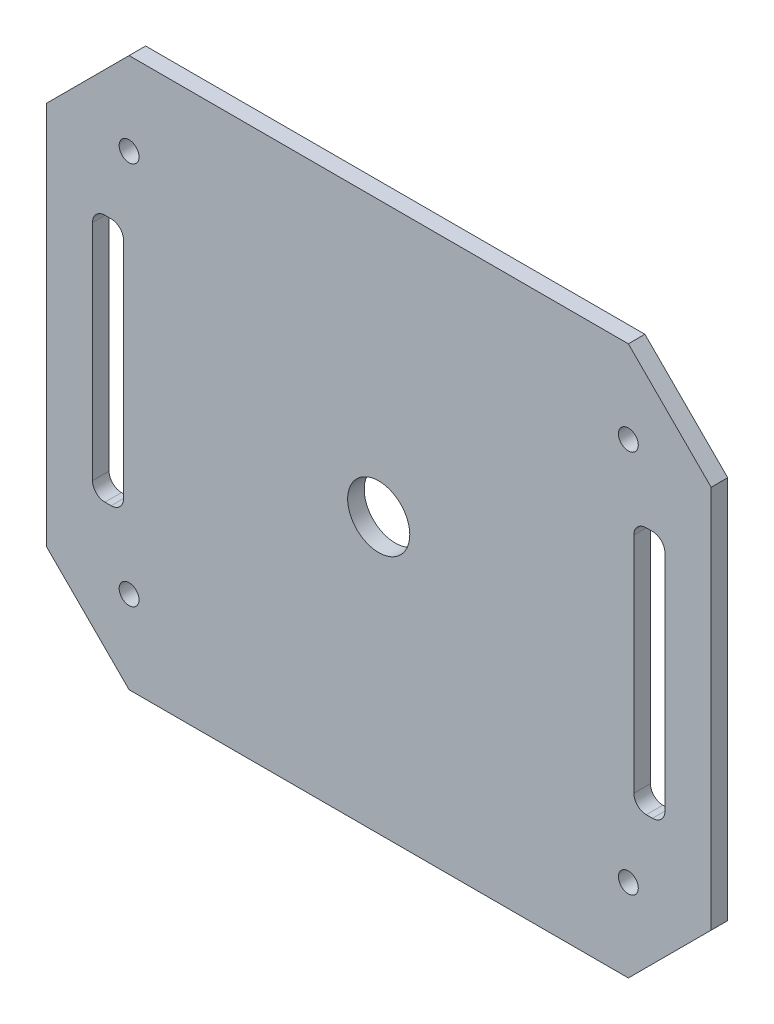
ISO-10303-21;
HEADER;
FILE_DESCRIPTION(('STEP AP214'),'2;1');
FILE_NAME('part.step','',(''),(''),'','','');
FILE_SCHEMA(('AUTOMOTIVE_DESIGN { 1 0 10303 214 1 1 1 1 }'));
ENDSEC;
DATA;
#1=APPLICATION_CONTEXT('core data for automotive mechanical design processes');
#2=APPLICATION_PROTOCOL_DEFINITION('international standard','automotive_design',2000,#1);
#3=PRODUCT_CONTEXT('',#1,'mechanical');
#4=PRODUCT('Part','Part','',(#3));
#5=PRODUCT_RELATED_PRODUCT_CATEGORY('part','',(#4));
#6=PRODUCT_DEFINITION_FORMATION('','',#4);
#7=PRODUCT_DEFINITION_CONTEXT('part definition',#1,'design');
#8=PRODUCT_DEFINITION('design','',#6,#7);
#9=PRODUCT_DEFINITION_SHAPE('','',#8);
#10=(LENGTH_UNIT() NAMED_UNIT(*) SI_UNIT(.MILLI.,.METRE.));
#11=(NAMED_UNIT(*) PLANE_ANGLE_UNIT() SI_UNIT($,.RADIAN.));
#12=(NAMED_UNIT(*) SI_UNIT($,.STERADIAN.) SOLID_ANGLE_UNIT());
#13=UNCERTAINTY_MEASURE_WITH_UNIT(LENGTH_MEASURE(1.E-05),#10,'distance_accuracy_value','');
#14=(GEOMETRIC_REPRESENTATION_CONTEXT(3) GLOBAL_UNCERTAINTY_ASSIGNED_CONTEXT((#13)) GLOBAL_UNIT_ASSIGNED_CONTEXT((#10,
#11,#12)) REPRESENTATION_CONTEXT('',''));
#15=CARTESIAN_POINT('',(0.,0.,0.));
#16=DIRECTION('',(0.,0.,1.));
#17=DIRECTION('',(1.,0.,0.));
#18=AXIS2_PLACEMENT_3D('',#15,#16,#17);
#19=CARTESIAN_POINT('',(0.,0.,3.));
#20=DIRECTION('',(0.,0.,1.));
#21=DIRECTION('',(1.,0.,0.));
#22=AXIS2_PLACEMENT_3D('',#19,#20,#21);
#23=PLANE('',#22);
#24=CARTESIAN_POINT('',(0.164261760075,-107.544565590663,3.));
#25=DIRECTION('',(0.,0.,1.));
#26=DIRECTION('',(1.,0.,0.));
#27=AXIS2_PLACEMENT_3D('',#24,#25,#26);
#28=CIRCLE('',#27,1.8);
#29=CARTESIAN_POINT('',(1.964261760075,-107.544565590663,3.));
#30=VERTEX_POINT('',#29);
#31=EDGE_CURVE('E662',#30,#30,#28,.T.);
#32=ORIENTED_EDGE('',*,*,#31,.F.);
#33=EDGE_LOOP('',(#32));
#34=FACE_BOUND('',#33,.T.);
#35=CARTESIAN_POINT('',(90.588261760075,-38.0755655906625,3.));
#36=DIRECTION('',(0.,0.,1.));
#37=DIRECTION('',(1.,0.,0.));
#38=AXIS2_PLACEMENT_3D('',#35,#36,#37);
#39=CIRCLE('',#38,1.80000000000001);
#40=CARTESIAN_POINT('',(92.388261760075,-38.0755655906625,3.));
#41=VERTEX_POINT('',#40);
#42=EDGE_CURVE('E674',#41,#41,#39,.T.);
#43=ORIENTED_EDGE('',*,*,#42,.F.);
#44=EDGE_LOOP('',(#43));
#45=FACE_BOUND('',#44,.T.);
#46=DIRECTION('',(0.,1.,0.));
#47=VECTOR('',#46,1.);
#48=CARTESIAN_POINT('',(-0.835738239925015,-52.5600655906625,3.));
#49=LINE('',#48,#47);
#50=CARTESIAN_POINT('',(-0.835738239925015,-93.0600655906625,3.));
#51=VERTEX_POINT('',#50);
#52=CARTESIAN_POINT('',(-0.835738239925015,-52.5600655906625,3.));
#53=VERTEX_POINT('',#52);
#54=EDGE_CURVE('E202',#51,#53,#49,.T.);
#55=ORIENTED_EDGE('',*,*,#54,.F.);
#56=CARTESIAN_POINT('',(-3.08573823992502,-93.0600655906625,3.));
#57=DIRECTION('',(0.,0.,1.));
#58=DIRECTION('',(1.,0.,0.));
#59=AXIS2_PLACEMENT_3D('',#56,#57,#58);
#60=CIRCLE('',#59,2.25);
#61=CARTESIAN_POINT('',(-3.08573823992503,-95.3100655906625,3.));
#62=VERTEX_POINT('',#61);
#63=EDGE_CURVE('E194',#62,#51,#60,.T.);
#64=ORIENTED_EDGE('',*,*,#63,.F.);
#65=DIRECTION('',(1.,0.,0.));
#66=VECTOR('',#65,1.);
#67=CARTESIAN_POINT('',(-4.21073823992503,-95.3100655906625,3.));
#68=LINE('',#67,#66);
#69=CARTESIAN_POINT('',(-4.21073823992503,-95.3100655906625,3.));
#70=VERTEX_POINT('',#69);
#71=EDGE_CURVE('E229',#70,#62,#68,.T.);
#72=ORIENTED_EDGE('',*,*,#71,.F.);
#73=CARTESIAN_POINT('',(-4.21073823992503,-93.0600655906625,3.));
#74=DIRECTION('',(0.,0.,1.));
#75=DIRECTION('',(1.,0.,0.));
#76=AXIS2_PLACEMENT_3D('',#73,#74,#75);
#77=CIRCLE('',#76,2.25);
#78=CARTESIAN_POINT('',(-6.46073823992504,-93.0600655906625,3.));
#79=VERTEX_POINT('',#78);
#80=EDGE_CURVE('E227',#79,#70,#77,.T.);
#81=ORIENTED_EDGE('',*,*,#80,.F.);
#82=DIRECTION('',(0.,-1.,0.));
#83=VECTOR('',#82,1.);
#84=CARTESIAN_POINT('',(-6.46073823992504,-52.5600655906625,3.));
#85=LINE('',#84,#83);
#86=CARTESIAN_POINT('',(-6.46073823992504,-52.5600655906625,3.));
#87=VERTEX_POINT('',#86);
#88=EDGE_CURVE('E225',#87,#79,#85,.T.);
#89=ORIENTED_EDGE('',*,*,#88,.F.);
#90=CARTESIAN_POINT('',(-4.21073823992503,-52.5600655906625,3.));
#91=DIRECTION('',(0.,0.,1.));
#92=DIRECTION('',(1.,0.,0.));
#93=AXIS2_PLACEMENT_3D('',#90,#91,#92);
#94=CIRCLE('',#93,2.25);
#95=CARTESIAN_POINT('',(-4.21073823992503,-50.3100655906625,3.));
#96=VERTEX_POINT('',#95);
#97=EDGE_CURVE('E223',#96,#87,#94,.T.);
#98=ORIENTED_EDGE('',*,*,#97,.F.);
#99=DIRECTION('',(-1.,0.,0.));
#100=VECTOR('',#99,1.);
#101=CARTESIAN_POINT('',(-4.21073823992503,-50.3100655906625,3.));
#102=LINE('',#101,#100);
#103=CARTESIAN_POINT('',(-3.08573823992503,-50.3100655906625,3.));
#104=VERTEX_POINT('',#103);
#105=EDGE_CURVE('E218',#104,#96,#102,.T.);
#106=ORIENTED_EDGE('',*,*,#105,.F.);
#107=CARTESIAN_POINT('',(-3.08573823992502,-52.5600655906625,3.));
#108=DIRECTION('',(0.,0.,1.));
#109=DIRECTION('',(1.,0.,0.));
#110=AXIS2_PLACEMENT_3D('',#107,#108,#109);
#111=CIRCLE('',#110,2.25);
#112=EDGE_CURVE('E216',#53,#104,#111,.T.);
#113=ORIENTED_EDGE('',*,*,#112,.F.);
#114=EDGE_LOOP('',(#55,#64,#72,#81,#89,#98,#106,#113));
#115=FACE_BOUND('',#114,.T.);
#116=DIRECTION('',(-1.,0.,0.));
#117=VECTOR('',#116,1.);
#118=CARTESIAN_POINT('',(94.963261760075,-50.3100655906625,3.));
#119=LINE('',#118,#117);
#120=CARTESIAN_POINT('',(94.963261760075,-50.3100655906625,3.));
#121=VERTEX_POINT('',#120);
#122=CARTESIAN_POINT('',(93.838261760075,-50.3100655906625,3.));
#123=VERTEX_POINT('',#122);
#124=EDGE_CURVE('E264',#121,#123,#119,.T.);
#125=ORIENTED_EDGE('',*,*,#124,.F.);
#126=CARTESIAN_POINT('',(94.963261760075,-52.5600655906625,3.));
#127=DIRECTION('',(0.,0.,1.));
#128=DIRECTION('',(1.,0.,0.));
#129=AXIS2_PLACEMENT_3D('',#126,#127,#128);
#130=CIRCLE('',#129,2.25000000000001);
#131=CARTESIAN_POINT('',(97.213261760075,-52.5600655906625,3.));
#132=VERTEX_POINT('',#131);
#133=EDGE_CURVE('E262',#132,#121,#130,.T.);
#134=ORIENTED_EDGE('',*,*,#133,.F.);
#135=DIRECTION('',(0.,1.,0.));
#136=VECTOR('',#135,1.);
#137=CARTESIAN_POINT('',(97.213261760075,-52.5600655906625,3.));
#138=LINE('',#137,#136);
#139=CARTESIAN_POINT('',(97.213261760075,-93.0600655906625,3.));
#140=VERTEX_POINT('',#139);
#141=EDGE_CURVE('E278',#140,#132,#138,.T.);
#142=ORIENTED_EDGE('',*,*,#141,.F.);
#143=CARTESIAN_POINT('',(94.963261760075,-93.0600655906625,3.));
#144=DIRECTION('',(0.,0.,1.));
#145=DIRECTION('',(1.,0.,0.));
#146=AXIS2_PLACEMENT_3D('',#143,#144,#145);
#147=CIRCLE('',#146,2.25);
#148=CARTESIAN_POINT('',(94.963261760075,-95.3100655906625,3.));
#149=VERTEX_POINT('',#148);
#150=EDGE_CURVE('E275',#149,#140,#147,.T.);
#151=ORIENTED_EDGE('',*,*,#150,.F.);
#152=DIRECTION('',(1.,0.,0.));
#153=VECTOR('',#152,1.);
#154=CARTESIAN_POINT('',(94.963261760075,-95.3100655906625,3.));
#155=LINE('',#154,#153);
#156=CARTESIAN_POINT('',(93.838261760075,-95.3100655906625,3.));
#157=VERTEX_POINT('',#156);
#158=EDGE_CURVE('E273',#157,#149,#155,.T.);
#159=ORIENTED_EDGE('',*,*,#158,.F.);
#160=CARTESIAN_POINT('',(93.838261760075,-93.0600655906625,3.));
#161=DIRECTION('',(0.,0.,1.));
#162=DIRECTION('',(1.,0.,0.));
#163=AXIS2_PLACEMENT_3D('',#160,#161,#162);
#164=CIRCLE('',#163,2.25);
#165=CARTESIAN_POINT('',(91.588261760075,-93.0600655906625,3.));
#166=VERTEX_POINT('',#165);
#167=EDGE_CURVE('E271',#166,#157,#164,.T.);
#168=ORIENTED_EDGE('',*,*,#167,.F.);
#169=DIRECTION('',(0.,-1.,0.));
#170=VECTOR('',#169,1.);
#171=CARTESIAN_POINT('',(91.588261760075,-52.5600655906625,3.));
#172=LINE('',#171,#170);
#173=CARTESIAN_POINT('',(91.588261760075,-52.5600655906625,3.));
#174=VERTEX_POINT('',#173);
#175=EDGE_CURVE('E269',#174,#166,#172,.T.);
#176=ORIENTED_EDGE('',*,*,#175,.F.);
#177=CARTESIAN_POINT('',(93.838261760075,-52.5600655906625,3.));
#178=DIRECTION('',(0.,0.,1.));
#179=DIRECTION('',(1.,0.,0.));
#180=AXIS2_PLACEMENT_3D('',#177,#178,#179);
#181=CIRCLE('',#180,2.25);
#182=EDGE_CURVE('E267',#123,#174,#181,.T.);
#183=ORIENTED_EDGE('',*,*,#182,.F.);
#184=EDGE_LOOP('',(#125,#134,#142,#151,#159,#168,#176,#183));
#185=FACE_BOUND('',#184,.T.);
#186=DIRECTION('',(0.,-1.,0.));
#187=VECTOR('',#186,1.);
#188=CARTESIAN_POINT('',(-14.835738239925,-38.0755655906625,3.));
#189=LINE('',#188,#187);
#190=CARTESIAN_POINT('',(-14.835738239925,-38.0755655906625,3.));
#191=VERTEX_POINT('',#190);
#192=CARTESIAN_POINT('',(-14.835738239925,-107.544565590663,3.));
#193=VERTEX_POINT('',#192);
#194=EDGE_CURVE('E321',#191,#193,#189,.T.);
#195=ORIENTED_EDGE('',*,*,#194,.T.);
#196=DIRECTION('',(0.707106781186547,-0.707106781186547,0.));
#197=VECTOR('',#196,1.);
#198=CARTESIAN_POINT('',(-14.835738239925,-107.544565590663,3.));
#199=LINE('',#198,#197);
#200=CARTESIAN_POINT('',(0.164261760075,-122.544565590663,3.));
#201=VERTEX_POINT('',#200);
#202=EDGE_CURVE('E324',#193,#201,#199,.T.);
#203=ORIENTED_EDGE('',*,*,#202,.T.);
#204=DIRECTION('',(1.,0.,0.));
#205=VECTOR('',#204,1.);
#206=CARTESIAN_POINT('',(0.164261760075,-122.544565590663,3.));
#207=LINE('',#206,#205);
#208=CARTESIAN_POINT('',(90.588261760075,-122.544565590663,3.));
#209=VERTEX_POINT('',#208);
#210=EDGE_CURVE('E327',#201,#209,#207,.T.);
#211=ORIENTED_EDGE('',*,*,#210,.T.);
#212=DIRECTION('',(0.707106781186547,0.707106781186547,0.));
#213=VECTOR('',#212,1.);
#214=CARTESIAN_POINT('',(90.588261760075,-122.544565590663,3.));
#215=LINE('',#214,#213);
#216=CARTESIAN_POINT('',(105.588261760075,-107.544565590663,3.));
#217=VERTEX_POINT('',#216);
#218=EDGE_CURVE('E329',#209,#217,#215,.T.);
#219=ORIENTED_EDGE('',*,*,#218,.T.);
#220=DIRECTION('',(0.,1.,0.));
#221=VECTOR('',#220,1.);
#222=CARTESIAN_POINT('',(105.588261760075,-38.0755655906625,3.));
#223=LINE('',#222,#221);
#224=CARTESIAN_POINT('',(105.588261760075,-38.0755655906625,3.));
#225=VERTEX_POINT('',#224);
#226=EDGE_CURVE('E331',#217,#225,#223,.T.);
#227=ORIENTED_EDGE('',*,*,#226,.T.);
#228=DIRECTION('',(-0.707106781186547,0.707106781186547,0.));
#229=VECTOR('',#228,1.);
#230=CARTESIAN_POINT('',(90.588261760075,-23.0755655906625,3.));
#231=LINE('',#230,#229);
#232=CARTESIAN_POINT('',(90.588261760075,-23.0755655906625,3.));
#233=VERTEX_POINT('',#232);
#234=EDGE_CURVE('E333',#225,#233,#231,.T.);
#235=ORIENTED_EDGE('',*,*,#234,.T.);
#236=DIRECTION('',(-1.,0.,0.));
#237=VECTOR('',#236,1.);
#238=CARTESIAN_POINT('',(0.164261760075,-23.0755655906625,3.));
#239=LINE('',#238,#237);
#240=CARTESIAN_POINT('',(0.164261760075,-23.0755655906625,3.));
#241=VERTEX_POINT('',#240);
#242=EDGE_CURVE('E335',#233,#241,#239,.T.);
#243=ORIENTED_EDGE('',*,*,#242,.T.);
#244=DIRECTION('',(-0.707106781186547,-0.707106781186547,0.));
#245=VECTOR('',#244,1.);
#246=CARTESIAN_POINT('',(-14.835738239925,-38.0755655906625,3.));
#247=LINE('',#246,#245);
#248=EDGE_CURVE('E337',#241,#191,#247,.T.);
#249=ORIENTED_EDGE('',*,*,#248,.T.);
#250=EDGE_LOOP('',(#195,#203,#211,#219,#227,#235,#243,#249));
#251=FACE_BOUND('',#250,.T.);
#252=CARTESIAN_POINT('',(0.164261760075,-38.0755655906625,3.));
#253=DIRECTION('',(0.,0.,1.));
#254=DIRECTION('',(1.,0.,0.));
#255=AXIS2_PLACEMENT_3D('',#252,#253,#254);
#256=CIRCLE('',#255,1.8);
#257=CARTESIAN_POINT('',(1.964261760075,-38.0755655906625,3.));
#258=VERTEX_POINT('',#257);
#259=EDGE_CURVE('E232',#258,#258,#256,.T.);
#260=ORIENTED_EDGE('',*,*,#259,.F.);
#261=EDGE_LOOP('',(#260));
#262=FACE_BOUND('',#261,.T.);
#263=CARTESIAN_POINT('',(90.588261760075,-107.544565590663,3.));
#264=DIRECTION('',(0.,0.,1.));
#265=DIRECTION('',(1.,0.,0.));
#266=AXIS2_PLACEMENT_3D('',#263,#264,#265);
#267=CIRCLE('',#266,1.80000000000001);
#268=CARTESIAN_POINT('',(92.388261760075,-107.544565590663,3.));
#269=VERTEX_POINT('',#268);
#270=EDGE_CURVE('E668',#269,#269,#267,.T.);
#271=ORIENTED_EDGE('',*,*,#270,.F.);
#272=EDGE_LOOP('',(#271));
#273=FACE_BOUND('',#272,.T.);
#274=CARTESIAN_POINT('',(45.376261760075,-72.8100655906625,3.));
#275=DIRECTION('',(0.,0.,1.));
#276=DIRECTION('',(1.,0.,0.));
#277=AXIS2_PLACEMENT_3D('',#274,#275,#276);
#278=CIRCLE('',#277,5.625);
#279=CARTESIAN_POINT('',(51.001261760075,-72.8100655906625,3.));
#280=VERTEX_POINT('',#279);
#281=EDGE_CURVE('E653',#280,#280,#278,.T.);
#282=ORIENTED_EDGE('',*,*,#281,.F.);
#283=EDGE_LOOP('',(#282));
#284=FACE_BOUND('',#283,.T.);
#285=ADVANCED_FACE('F33',(#34,#45,#115,#185,#251,#262,#273,#284),#23,.T.);
#286=CARTESIAN_POINT('',(0.,0.,0.));
#287=DIRECTION('',(0.,0.,1.));
#288=DIRECTION('',(1.,0.,0.));
#289=AXIS2_PLACEMENT_3D('',#286,#287,#288);
#290=PLANE('',#289);
#291=CARTESIAN_POINT('',(94.963261760075,-52.5600655906625,0.));
#292=DIRECTION('',(0.,0.,1.));
#293=DIRECTION('',(1.,0.,0.));
#294=AXIS2_PLACEMENT_3D('',#291,#292,#293);
#295=CIRCLE('',#294,2.25000000000001);
#296=CARTESIAN_POINT('',(97.213261760075,-52.5600655906625,0.));
#297=VERTEX_POINT('',#296);
#298=CARTESIAN_POINT('',(94.963261760075,-50.3100655906625,0.));
#299=VERTEX_POINT('',#298);
#300=EDGE_CURVE('E210',#297,#299,#295,.T.);
#301=ORIENTED_EDGE('',*,*,#300,.T.);
#302=DIRECTION('',(-1.,0.,0.));
#303=VECTOR('',#302,1.);
#304=CARTESIAN_POINT('',(94.963261760075,-50.3100655906625,0.));
#305=LINE('',#304,#303);
#306=CARTESIAN_POINT('',(93.838261760075,-50.3100655906625,0.));
#307=VERTEX_POINT('',#306);
#308=EDGE_CURVE('E283',#299,#307,#305,.T.);
#309=ORIENTED_EDGE('',*,*,#308,.T.);
#310=CARTESIAN_POINT('',(93.838261760075,-52.5600655906625,0.));
#311=DIRECTION('',(0.,0.,1.));
#312=DIRECTION('',(1.,0.,0.));
#313=AXIS2_PLACEMENT_3D('',#310,#311,#312);
#314=CIRCLE('',#313,2.25);
#315=CARTESIAN_POINT('',(91.588261760075,-52.5600655906625,0.));
#316=VERTEX_POINT('',#315);
#317=EDGE_CURVE('E286',#307,#316,#314,.T.);
#318=ORIENTED_EDGE('',*,*,#317,.T.);
#319=DIRECTION('',(0.,-1.,0.));
#320=VECTOR('',#319,1.);
#321=CARTESIAN_POINT('',(91.588261760075,-52.5600655906625,0.));
#322=LINE('',#321,#320);
#323=CARTESIAN_POINT('',(91.588261760075,-93.0600655906625,0.));
#324=VERTEX_POINT('',#323);
#325=EDGE_CURVE('E289',#316,#324,#322,.T.);
#326=ORIENTED_EDGE('',*,*,#325,.T.);
#327=CARTESIAN_POINT('',(93.838261760075,-93.0600655906625,0.));
#328=DIRECTION('',(0.,0.,1.));
#329=DIRECTION('',(1.,0.,0.));
#330=AXIS2_PLACEMENT_3D('',#327,#328,#329);
#331=CIRCLE('',#330,2.25);
#332=CARTESIAN_POINT('',(93.838261760075,-95.3100655906625,0.));
#333=VERTEX_POINT('',#332);
#334=EDGE_CURVE('E292',#324,#333,#331,.T.);
#335=ORIENTED_EDGE('',*,*,#334,.T.);
#336=DIRECTION('',(1.,0.,0.));
#337=VECTOR('',#336,1.);
#338=CARTESIAN_POINT('',(94.963261760075,-95.3100655906625,0.));
#339=LINE('',#338,#337);
#340=CARTESIAN_POINT('',(94.963261760075,-95.3100655906625,0.));
#341=VERTEX_POINT('',#340);
#342=EDGE_CURVE('E295',#333,#341,#339,.T.);
#343=ORIENTED_EDGE('',*,*,#342,.T.);
#344=CARTESIAN_POINT('',(94.963261760075,-93.0600655906625,0.));
#345=DIRECTION('',(0.,0.,1.));
#346=DIRECTION('',(1.,0.,0.));
#347=AXIS2_PLACEMENT_3D('',#344,#345,#346);
#348=CIRCLE('',#347,2.25);
#349=CARTESIAN_POINT('',(97.213261760075,-93.0600655906625,0.));
#350=VERTEX_POINT('',#349);
#351=EDGE_CURVE('E298',#341,#350,#348,.T.);
#352=ORIENTED_EDGE('',*,*,#351,.T.);
#353=DIRECTION('',(0.,1.,0.));
#354=VECTOR('',#353,1.);
#355=CARTESIAN_POINT('',(97.213261760075,-52.5600655906625,0.));
#356=LINE('',#355,#354);
#357=EDGE_CURVE('E265',#350,#297,#356,.T.);
#358=ORIENTED_EDGE('',*,*,#357,.T.);
#359=EDGE_LOOP('',(#301,#309,#318,#326,#335,#343,#352,#358));
#360=FACE_BOUND('',#359,.T.);
#361=DIRECTION('',(0.,-1.,0.));
#362=VECTOR('',#361,1.);
#363=CARTESIAN_POINT('',(-14.835738239925,-38.0755655906625,0.));
#364=LINE('',#363,#362);
#365=CARTESIAN_POINT('',(-14.835738239925,-38.0755655906625,0.));
#366=VERTEX_POINT('',#365);
#367=CARTESIAN_POINT('',(-14.835738239925,-107.544565590663,0.));
#368=VERTEX_POINT('',#367);
#369=EDGE_CURVE('E320',#366,#368,#364,.T.);
#370=ORIENTED_EDGE('',*,*,#369,.F.);
#371=DIRECTION('',(-0.707106781186547,-0.707106781186547,0.));
#372=VECTOR('',#371,1.);
#373=CARTESIAN_POINT('',(-14.835738239925,-38.0755655906625,0.));
#374=LINE('',#373,#372);
#375=CARTESIAN_POINT('',(0.164261760075,-23.0755655906625,0.));
#376=VERTEX_POINT('',#375);
#377=EDGE_CURVE('E325',#376,#366,#374,.T.);
#378=ORIENTED_EDGE('',*,*,#377,.F.);
#379=DIRECTION('',(-1.,0.,0.));
#380=VECTOR('',#379,1.);
#381=CARTESIAN_POINT('',(0.164261760075,-23.0755655906625,0.));
#382=LINE('',#381,#380);
#383=CARTESIAN_POINT('',(90.588261760075,-23.0755655906625,0.));
#384=VERTEX_POINT('',#383);
#385=EDGE_CURVE('E352',#384,#376,#382,.T.);
#386=ORIENTED_EDGE('',*,*,#385,.F.);
#387=DIRECTION('',(-0.707106781186547,0.707106781186547,0.));
#388=VECTOR('',#387,1.);
#389=CARTESIAN_POINT('',(90.588261760075,-23.0755655906625,0.));
#390=LINE('',#389,#388);
#391=CARTESIAN_POINT('',(105.588261760075,-38.0755655906625,0.));
#392=VERTEX_POINT('',#391);
#393=EDGE_CURVE('E350',#392,#384,#390,.T.);
#394=ORIENTED_EDGE('',*,*,#393,.F.);
#395=DIRECTION('',(0.,1.,0.));
#396=VECTOR('',#395,1.);
#397=CARTESIAN_POINT('',(105.588261760075,-38.0755655906625,0.));
#398=LINE('',#397,#396);
#399=CARTESIAN_POINT('',(105.588261760075,-107.544565590663,0.));
#400=VERTEX_POINT('',#399);
#401=EDGE_CURVE('E348',#400,#392,#398,.T.);
#402=ORIENTED_EDGE('',*,*,#401,.F.);
#403=DIRECTION('',(0.707106781186547,0.707106781186547,0.));
#404=VECTOR('',#403,1.);
#405=CARTESIAN_POINT('',(90.588261760075,-122.544565590663,0.));
#406=LINE('',#405,#404);
#407=CARTESIAN_POINT('',(90.588261760075,-122.544565590663,0.));
#408=VERTEX_POINT('',#407);
#409=EDGE_CURVE('E346',#408,#400,#406,.T.);
#410=ORIENTED_EDGE('',*,*,#409,.F.);
#411=DIRECTION('',(1.,0.,0.));
#412=VECTOR('',#411,1.);
#413=CARTESIAN_POINT('',(0.164261760075,-122.544565590663,0.));
#414=LINE('',#413,#412);
#415=CARTESIAN_POINT('',(0.164261760075,-122.544565590663,0.));
#416=VERTEX_POINT('',#415);
#417=EDGE_CURVE('E344',#416,#408,#414,.T.);
#418=ORIENTED_EDGE('',*,*,#417,.F.);
#419=DIRECTION('',(0.707106781186547,-0.707106781186547,0.));
#420=VECTOR('',#419,1.);
#421=CARTESIAN_POINT('',(-14.835738239925,-107.544565590663,0.));
#422=LINE('',#421,#420);
#423=EDGE_CURVE('E342',#368,#416,#422,.T.);
#424=ORIENTED_EDGE('',*,*,#423,.F.);
#425=EDGE_LOOP('',(#370,#378,#386,#394,#402,#410,#418,#424));
#426=FACE_BOUND('',#425,.T.);
#427=CARTESIAN_POINT('',(-3.08573823992502,-93.0600655906625,0.));
#428=DIRECTION('',(0.,0.,1.));
#429=DIRECTION('',(1.,0.,0.));
#430=AXIS2_PLACEMENT_3D('',#427,#428,#429);
#431=CIRCLE('',#430,2.25);
#432=CARTESIAN_POINT('',(-3.08573823992503,-95.3100655906625,0.));
#433=VERTEX_POINT('',#432);
#434=CARTESIAN_POINT('',(-0.835738239925015,-93.0600655906625,0.));
#435=VERTEX_POINT('',#434);
#436=EDGE_CURVE('E56',#433,#435,#431,.T.);
#437=ORIENTED_EDGE('',*,*,#436,.T.);
#438=DIRECTION('',(0.,1.,0.));
#439=VECTOR('',#438,1.);
#440=CARTESIAN_POINT('',(-0.835738239925015,-52.5600655906625,0.));
#441=LINE('',#440,#439);
#442=CARTESIAN_POINT('',(-0.835738239925015,-52.5600655906625,0.));
#443=VERTEX_POINT('',#442);
#444=EDGE_CURVE('E209',#435,#443,#441,.T.);
#445=ORIENTED_EDGE('',*,*,#444,.T.);
#446=CARTESIAN_POINT('',(-3.08573823992502,-52.5600655906625,0.));
#447=DIRECTION('',(0.,0.,1.));
#448=DIRECTION('',(1.,0.,0.));
#449=AXIS2_PLACEMENT_3D('',#446,#447,#448);
#450=CIRCLE('',#449,2.25);
#451=CARTESIAN_POINT('',(-3.08573823992503,-50.3100655906625,0.));
#452=VERTEX_POINT('',#451);
#453=EDGE_CURVE('E234',#443,#452,#450,.T.);
#454=ORIENTED_EDGE('',*,*,#453,.T.);
#455=DIRECTION('',(-1.,0.,0.));
#456=VECTOR('',#455,1.);
#457=CARTESIAN_POINT('',(-4.21073823992503,-50.3100655906625,0.));
#458=LINE('',#457,#456);
#459=CARTESIAN_POINT('',(-4.21073823992503,-50.3100655906625,0.));
#460=VERTEX_POINT('',#459);
#461=EDGE_CURVE('E237',#452,#460,#458,.T.);
#462=ORIENTED_EDGE('',*,*,#461,.T.);
#463=CARTESIAN_POINT('',(-4.21073823992503,-52.5600655906625,0.));
#464=DIRECTION('',(0.,0.,1.));
#465=DIRECTION('',(1.,0.,0.));
#466=AXIS2_PLACEMENT_3D('',#463,#464,#465);
#467=CIRCLE('',#466,2.25);
#468=CARTESIAN_POINT('',(-6.46073823992504,-52.5600655906625,0.));
#469=VERTEX_POINT('',#468);
#470=EDGE_CURVE('E240',#460,#469,#467,.T.);
#471=ORIENTED_EDGE('',*,*,#470,.T.);
#472=DIRECTION('',(0.,-1.,0.));
#473=VECTOR('',#472,1.);
#474=CARTESIAN_POINT('',(-6.46073823992504,-52.5600655906625,0.));
#475=LINE('',#474,#473);
#476=CARTESIAN_POINT('',(-6.46073823992504,-93.0600655906625,0.));
#477=VERTEX_POINT('',#476);
#478=EDGE_CURVE('E243',#469,#477,#475,.T.);
#479=ORIENTED_EDGE('',*,*,#478,.T.);
#480=CARTESIAN_POINT('',(-4.21073823992503,-93.0600655906625,0.));
#481=DIRECTION('',(0.,0.,1.));
#482=DIRECTION('',(1.,0.,0.));
#483=AXIS2_PLACEMENT_3D('',#480,#481,#482);
#484=CIRCLE('',#483,2.25);
#485=CARTESIAN_POINT('',(-4.21073823992503,-95.3100655906625,0.));
#486=VERTEX_POINT('',#485);
#487=EDGE_CURVE('E246',#477,#486,#484,.T.);
#488=ORIENTED_EDGE('',*,*,#487,.T.);
#489=DIRECTION('',(1.,0.,0.));
#490=VECTOR('',#489,1.);
#491=CARTESIAN_POINT('',(-4.21073823992503,-95.3100655906625,0.));
#492=LINE('',#491,#490);
#493=EDGE_CURVE('E203',#486,#433,#492,.T.);
#494=ORIENTED_EDGE('',*,*,#493,.T.);
#495=EDGE_LOOP('',(#437,#445,#454,#462,#471,#479,#488,#494));
#496=FACE_BOUND('',#495,.T.);
#497=CARTESIAN_POINT('',(0.164261760075,-38.0755655906625,0.));
#498=DIRECTION('',(0.,0.,1.));
#499=DIRECTION('',(1.,0.,0.));
#500=AXIS2_PLACEMENT_3D('',#497,#498,#499);
#501=CIRCLE('',#500,1.8);
#502=CARTESIAN_POINT('',(1.964261760075,-38.0755655906625,0.));
#503=VERTEX_POINT('',#502);
#504=EDGE_CURVE('E677',#503,#503,#501,.T.);
#505=ORIENTED_EDGE('',*,*,#504,.T.);
#506=EDGE_LOOP('',(#505));
#507=FACE_BOUND('',#506,.T.);
#508=CARTESIAN_POINT('',(90.588261760075,-38.0755655906625,0.));
#509=DIRECTION('',(0.,0.,1.));
#510=DIRECTION('',(1.,0.,0.));
#511=AXIS2_PLACEMENT_3D('',#508,#509,#510);
#512=CIRCLE('',#511,1.80000000000001);
#513=CARTESIAN_POINT('',(92.388261760075,-38.0755655906625,0.));
#514=VERTEX_POINT('',#513);
#515=EDGE_CURVE('E671',#514,#514,#512,.T.);
#516=ORIENTED_EDGE('',*,*,#515,.T.);
#517=EDGE_LOOP('',(#516));
#518=FACE_BOUND('',#517,.T.);
#519=CARTESIAN_POINT('',(90.588261760075,-107.544565590663,0.));
#520=DIRECTION('',(0.,0.,1.));
#521=DIRECTION('',(1.,0.,0.));
#522=AXIS2_PLACEMENT_3D('',#519,#520,#521);
#523=CIRCLE('',#522,1.80000000000001);
#524=CARTESIAN_POINT('',(92.388261760075,-107.544565590663,0.));
#525=VERTEX_POINT('',#524);
#526=EDGE_CURVE('E665',#525,#525,#523,.T.);
#527=ORIENTED_EDGE('',*,*,#526,.T.);
#528=EDGE_LOOP('',(#527));
#529=FACE_BOUND('',#528,.T.);
#530=CARTESIAN_POINT('',(0.164261760075,-107.544565590663,0.));
#531=DIRECTION('',(0.,0.,1.));
#532=DIRECTION('',(1.,0.,0.));
#533=AXIS2_PLACEMENT_3D('',#530,#531,#532);
#534=CIRCLE('',#533,1.8);
#535=CARTESIAN_POINT('',(1.964261760075,-107.544565590663,0.));
#536=VERTEX_POINT('',#535);
#537=EDGE_CURVE('E659',#536,#536,#534,.T.);
#538=ORIENTED_EDGE('',*,*,#537,.T.);
#539=EDGE_LOOP('',(#538));
#540=FACE_BOUND('',#539,.T.);
#541=CARTESIAN_POINT('',(45.376261760075,-72.8100655906625,0.));
#542=DIRECTION('',(0.,0.,1.));
#543=DIRECTION('',(1.,0.,0.));
#544=AXIS2_PLACEMENT_3D('',#541,#542,#543);
#545=CIRCLE('',#544,5.625);
#546=CARTESIAN_POINT('',(51.001261760075,-72.8100655906625,0.));
#547=VERTEX_POINT('',#546);
#548=EDGE_CURVE('E656',#547,#547,#545,.T.);
#549=ORIENTED_EDGE('',*,*,#548,.T.);
#550=EDGE_LOOP('',(#549));
#551=FACE_BOUND('',#550,.T.);
#552=ADVANCED_FACE('F382',(#360,#426,#496,#507,#518,#529,#540,#551),#290,.F.);
#553=CARTESIAN_POINT('',(-14.835738239925,-38.0755655906625,3.));
#554=DIRECTION('',(1.,0.,0.));
#555=DIRECTION('',(0.,0.,-1.));
#556=AXIS2_PLACEMENT_3D('',#553,#554,#555);
#557=PLANE('',#556);
#558=ORIENTED_EDGE('',*,*,#369,.T.);
#559=DIRECTION('',(0.,0.,-1.));
#560=VECTOR('',#559,1.);
#561=CARTESIAN_POINT('',(-14.835738239925,-107.544565590663,3.));
#562=LINE('',#561,#560);
#563=EDGE_CURVE('E11',#193,#368,#562,.T.);
#564=ORIENTED_EDGE('',*,*,#563,.F.);
#565=ORIENTED_EDGE('',*,*,#194,.F.);
#566=DIRECTION('',(0.,0.,-1.));
#567=VECTOR('',#566,1.);
#568=CARTESIAN_POINT('',(-14.835738239925,-38.0755655906625,3.));
#569=LINE('',#568,#567);
#570=EDGE_CURVE('E339',#191,#366,#569,.T.);
#571=ORIENTED_EDGE('',*,*,#570,.T.);
#572=EDGE_LOOP('',(#558,#564,#565,#571));
#573=FACE_BOUND('',#572,.T.);
#574=ADVANCED_FACE('F35',(#573),#557,.F.);
#575=CARTESIAN_POINT('',(-14.835738239925,-107.544565590663,3.));
#576=DIRECTION('',(0.707106781186548,0.707106781186548,0.));
#577=DIRECTION('',(-0.707106781186548,0.707106781186548,0.));
#578=AXIS2_PLACEMENT_3D('',#575,#576,#577);
#579=PLANE('',#578);
#580=ORIENTED_EDGE('',*,*,#423,.T.);
#581=DIRECTION('',(0.,0.,-1.));
#582=VECTOR('',#581,1.);
#583=CARTESIAN_POINT('',(0.164261760075,-122.544565590663,3.));
#584=LINE('',#583,#582);
#585=EDGE_CURVE('E41',#201,#416,#584,.T.);
#586=ORIENTED_EDGE('',*,*,#585,.F.);
#587=ORIENTED_EDGE('',*,*,#202,.F.);
#588=ORIENTED_EDGE('',*,*,#563,.T.);
#589=EDGE_LOOP('',(#580,#586,#587,#588));
#590=FACE_BOUND('',#589,.T.);
#591=ADVANCED_FACE('F400',(#590),#579,.F.);
#592=CARTESIAN_POINT('',(0.164261760075,-122.544565590663,3.));
#593=DIRECTION('',(0.,1.,0.));
#594=DIRECTION('',(0.,0.,1.));
#595=AXIS2_PLACEMENT_3D('',#592,#593,#594);
#596=PLANE('',#595);
#597=ORIENTED_EDGE('',*,*,#417,.T.);
#598=DIRECTION('',(0.,0.,-1.));
#599=VECTOR('',#598,1.);
#600=CARTESIAN_POINT('',(90.588261760075,-122.544565590663,3.));
#601=LINE('',#600,#599);
#602=EDGE_CURVE('E369',#209,#408,#601,.T.);
#603=ORIENTED_EDGE('',*,*,#602,.F.);
#604=ORIENTED_EDGE('',*,*,#210,.F.);
#605=ORIENTED_EDGE('',*,*,#585,.T.);
#606=EDGE_LOOP('',(#597,#603,#604,#605));
#607=FACE_BOUND('',#606,.T.);
#608=ADVANCED_FACE('F376',(#607),#596,.F.);
#609=CARTESIAN_POINT('',(90.588261760075,-122.544565590663,3.));
#610=DIRECTION('',(-0.707106781186548,0.707106781186548,0.));
#611=DIRECTION('',(-0.707106781186548,-0.707106781186548,0.));
#612=AXIS2_PLACEMENT_3D('',#609,#610,#611);
#613=PLANE('',#612);
#614=ORIENTED_EDGE('',*,*,#409,.T.);
#615=DIRECTION('',(0.,0.,-1.));
#616=VECTOR('',#615,1.);
#617=CARTESIAN_POINT('',(105.588261760075,-107.544565590663,3.));
#618=LINE('',#617,#616);
#619=EDGE_CURVE('E366',#217,#400,#618,.T.);
#620=ORIENTED_EDGE('',*,*,#619,.F.);
#621=ORIENTED_EDGE('',*,*,#218,.F.);
#622=ORIENTED_EDGE('',*,*,#602,.T.);
#623=EDGE_LOOP('',(#614,#620,#621,#622));
#624=FACE_BOUND('',#623,.T.);
#625=ADVANCED_FACE('F388',(#624),#613,.F.);
#626=CARTESIAN_POINT('',(105.588261760075,-38.0755655906625,3.));
#627=DIRECTION('',(-1.,0.,0.));
#628=DIRECTION('',(0.,0.,1.));
#629=AXIS2_PLACEMENT_3D('',#626,#627,#628);
#630=PLANE('',#629);
#631=ORIENTED_EDGE('',*,*,#401,.T.);
#632=DIRECTION('',(0.,0.,-1.));
#633=VECTOR('',#632,1.);
#634=CARTESIAN_POINT('',(105.588261760075,-38.0755655906625,3.));
#635=LINE('',#634,#633);
#636=EDGE_CURVE('E363',#225,#392,#635,.T.);
#637=ORIENTED_EDGE('',*,*,#636,.F.);
#638=ORIENTED_EDGE('',*,*,#226,.F.);
#639=ORIENTED_EDGE('',*,*,#619,.T.);
#640=EDGE_LOOP('',(#631,#637,#638,#639));
#641=FACE_BOUND('',#640,.T.);
#642=ADVANCED_FACE('F392',(#641),#630,.F.);
#643=CARTESIAN_POINT('',(90.588261760075,-23.0755655906625,3.));
#644=DIRECTION('',(-0.707106781186548,-0.707106781186548,0.));
#645=DIRECTION('',(0.707106781186548,-0.707106781186548,0.));
#646=AXIS2_PLACEMENT_3D('',#643,#644,#645);
#647=PLANE('',#646);
#648=ORIENTED_EDGE('',*,*,#393,.T.);
#649=DIRECTION('',(0.,0.,-1.));
#650=VECTOR('',#649,1.);
#651=CARTESIAN_POINT('',(90.588261760075,-23.0755655906625,3.));
#652=LINE('',#651,#650);
#653=EDGE_CURVE('E360',#233,#384,#652,.T.);
#654=ORIENTED_EDGE('',*,*,#653,.F.);
#655=ORIENTED_EDGE('',*,*,#234,.F.);
#656=ORIENTED_EDGE('',*,*,#636,.T.);
#657=EDGE_LOOP('',(#648,#654,#655,#656));
#658=FACE_BOUND('',#657,.T.);
#659=ADVANCED_FACE('F413',(#658),#647,.F.);
#660=CARTESIAN_POINT('',(0.164261760075,-23.0755655906625,3.));
#661=DIRECTION('',(0.,-1.,0.));
#662=DIRECTION('',(0.,0.,-1.));
#663=AXIS2_PLACEMENT_3D('',#660,#661,#662);
#664=PLANE('',#663);
#665=ORIENTED_EDGE('',*,*,#385,.T.);
#666=DIRECTION('',(0.,0.,-1.));
#667=VECTOR('',#666,1.);
#668=CARTESIAN_POINT('',(0.164261760075,-23.0755655906625,3.));
#669=LINE('',#668,#667);
#670=EDGE_CURVE('E357',#241,#376,#669,.T.);
#671=ORIENTED_EDGE('',*,*,#670,.F.);
#672=ORIENTED_EDGE('',*,*,#242,.F.);
#673=ORIENTED_EDGE('',*,*,#653,.T.);
#674=EDGE_LOOP('',(#665,#671,#672,#673));
#675=FACE_BOUND('',#674,.T.);
#676=ADVANCED_FACE('F411',(#675),#664,.F.);
#677=CARTESIAN_POINT('',(-14.835738239925,-38.0755655906625,3.));
#678=DIRECTION('',(0.707106781186548,-0.707106781186548,0.));
#679=DIRECTION('',(0.707106781186548,0.707106781186548,0.));
#680=AXIS2_PLACEMENT_3D('',#677,#678,#679);
#681=PLANE('',#680);
#682=ORIENTED_EDGE('',*,*,#377,.T.);
#683=ORIENTED_EDGE('',*,*,#570,.F.);
#684=ORIENTED_EDGE('',*,*,#248,.F.);
#685=ORIENTED_EDGE('',*,*,#670,.T.);
#686=EDGE_LOOP('',(#682,#683,#684,#685));
#687=FACE_BOUND('',#686,.T.);
#688=ADVANCED_FACE('F406',(#687),#681,.F.);
#689=CARTESIAN_POINT('',(94.963261760075,-52.5600655906625,3.));
#690=DIRECTION('',(0.,0.,-1.));
#691=DIRECTION('',(-1.,0.,0.));
#692=AXIS2_PLACEMENT_3D('',#689,#690,#691);
#693=CYLINDRICAL_SURFACE('',#692,2.25000000000001);
#694=ORIENTED_EDGE('',*,*,#300,.F.);
#695=DIRECTION('',(0.,0.,-1.));
#696=VECTOR('',#695,1.);
#697=CARTESIAN_POINT('',(97.213261760075,-52.5600655906625,3.));
#698=LINE('',#697,#696);
#699=EDGE_CURVE('E280',#132,#297,#698,.T.);
#700=ORIENTED_EDGE('',*,*,#699,.F.);
#701=ORIENTED_EDGE('',*,*,#133,.T.);
#702=DIRECTION('',(0.,0.,-1.));
#703=VECTOR('',#702,1.);
#704=CARTESIAN_POINT('',(94.963261760075,-50.3100655906625,3.));
#705=LINE('',#704,#703);
#706=EDGE_CURVE('E317',#121,#299,#705,.T.);
#707=ORIENTED_EDGE('',*,*,#706,.T.);
#708=EDGE_LOOP('',(#694,#700,#701,#707));
#709=FACE_BOUND('',#708,.T.);
#710=ADVANCED_FACE('F433',(#709),#693,.F.);
#711=CARTESIAN_POINT('',(94.963261760075,-50.3100655906625,3.));
#712=DIRECTION('',(0.,-1.,0.));
#713=DIRECTION('',(0.,0.,-1.));
#714=AXIS2_PLACEMENT_3D('',#711,#712,#713);
#715=PLANE('',#714);
#716=ORIENTED_EDGE('',*,*,#308,.F.);
#717=ORIENTED_EDGE('',*,*,#706,.F.);
#718=ORIENTED_EDGE('',*,*,#124,.T.);
#719=DIRECTION('',(0.,0.,-1.));
#720=VECTOR('',#719,1.);
#721=CARTESIAN_POINT('',(93.838261760075,-50.3100655906625,3.));
#722=LINE('',#721,#720);
#723=EDGE_CURVE('E315',#123,#307,#722,.T.);
#724=ORIENTED_EDGE('',*,*,#723,.T.);
#725=EDGE_LOOP('',(#716,#717,#718,#724));
#726=FACE_BOUND('',#725,.T.);
#727=ADVANCED_FACE('F440',(#726),#715,.T.);
#728=CARTESIAN_POINT('',(93.838261760075,-52.5600655906625,3.));
#729=DIRECTION('',(0.,0.,-1.));
#730=DIRECTION('',(-1.,0.,0.));
#731=AXIS2_PLACEMENT_3D('',#728,#729,#730);
#732=CYLINDRICAL_SURFACE('',#731,2.25);
#733=ORIENTED_EDGE('',*,*,#317,.F.);
#734=ORIENTED_EDGE('',*,*,#723,.F.);
#735=ORIENTED_EDGE('',*,*,#182,.T.);
#736=DIRECTION('',(0.,0.,-1.));
#737=VECTOR('',#736,1.);
#738=CARTESIAN_POINT('',(91.588261760075,-52.5600655906625,3.));
#739=LINE('',#738,#737);
#740=EDGE_CURVE('E313',#174,#316,#739,.T.);
#741=ORIENTED_EDGE('',*,*,#740,.T.);
#742=EDGE_LOOP('',(#733,#734,#735,#741));
#743=FACE_BOUND('',#742,.T.);
#744=ADVANCED_FACE('F445',(#743),#732,.F.);
#745=CARTESIAN_POINT('',(91.588261760075,-52.5600655906625,3.));
#746=DIRECTION('',(1.,0.,0.));
#747=DIRECTION('',(0.,1.,0.));
#748=AXIS2_PLACEMENT_3D('',#745,#746,#747);
#749=PLANE('',#748);
#750=ORIENTED_EDGE('',*,*,#325,.F.);
#751=ORIENTED_EDGE('',*,*,#740,.F.);
#752=ORIENTED_EDGE('',*,*,#175,.T.);
#753=DIRECTION('',(0.,0.,-1.));
#754=VECTOR('',#753,1.);
#755=CARTESIAN_POINT('',(91.588261760075,-93.0600655906625,3.));
#756=LINE('',#755,#754);
#757=EDGE_CURVE('E311',#166,#324,#756,.T.);
#758=ORIENTED_EDGE('',*,*,#757,.T.);
#759=EDGE_LOOP('',(#750,#751,#752,#758));
#760=FACE_BOUND('',#759,.T.);
#761=ADVANCED_FACE('F470',(#760),#749,.T.);
#762=CARTESIAN_POINT('',(93.838261760075,-93.0600655906625,3.));
#763=DIRECTION('',(0.,0.,-1.));
#764=DIRECTION('',(-1.,0.,0.));
#765=AXIS2_PLACEMENT_3D('',#762,#763,#764);
#766=CYLINDRICAL_SURFACE('',#765,2.25);
#767=ORIENTED_EDGE('',*,*,#334,.F.);
#768=ORIENTED_EDGE('',*,*,#757,.F.);
#769=ORIENTED_EDGE('',*,*,#167,.T.);
#770=DIRECTION('',(0.,0.,-1.));
#771=VECTOR('',#770,1.);
#772=CARTESIAN_POINT('',(93.838261760075,-95.3100655906625,3.));
#773=LINE('',#772,#771);
#774=EDGE_CURVE('E309',#157,#333,#773,.T.);
#775=ORIENTED_EDGE('',*,*,#774,.T.);
#776=EDGE_LOOP('',(#767,#768,#769,#775));
#777=FACE_BOUND('',#776,.T.);
#778=ADVANCED_FACE('F475',(#777),#766,.F.);
#779=CARTESIAN_POINT('',(94.963261760075,-95.3100655906625,3.));
#780=DIRECTION('',(0.,1.,0.));
#781=DIRECTION('',(0.,0.,1.));
#782=AXIS2_PLACEMENT_3D('',#779,#780,#781);
#783=PLANE('',#782);
#784=ORIENTED_EDGE('',*,*,#342,.F.);
#785=ORIENTED_EDGE('',*,*,#774,.F.);
#786=ORIENTED_EDGE('',*,*,#158,.T.);
#787=DIRECTION('',(0.,0.,-1.));
#788=VECTOR('',#787,1.);
#789=CARTESIAN_POINT('',(94.963261760075,-95.3100655906625,3.));
#790=LINE('',#789,#788);
#791=EDGE_CURVE('E307',#149,#341,#790,.T.);
#792=ORIENTED_EDGE('',*,*,#791,.T.);
#793=EDGE_LOOP('',(#784,#785,#786,#792));
#794=FACE_BOUND('',#793,.T.);
#795=ADVANCED_FACE('F478',(#794),#783,.T.);
#796=CARTESIAN_POINT('',(94.963261760075,-93.0600655906625,3.));
#797=DIRECTION('',(0.,0.,-1.));
#798=DIRECTION('',(-1.,0.,0.));
#799=AXIS2_PLACEMENT_3D('',#796,#797,#798);
#800=CYLINDRICAL_SURFACE('',#799,2.25);
#801=ORIENTED_EDGE('',*,*,#351,.F.);
#802=ORIENTED_EDGE('',*,*,#791,.F.);
#803=ORIENTED_EDGE('',*,*,#150,.T.);
#804=DIRECTION('',(0.,0.,-1.));
#805=VECTOR('',#804,1.);
#806=CARTESIAN_POINT('',(97.213261760075,-93.0600655906625,3.));
#807=LINE('',#806,#805);
#808=EDGE_CURVE('E305',#140,#350,#807,.T.);
#809=ORIENTED_EDGE('',*,*,#808,.T.);
#810=EDGE_LOOP('',(#801,#802,#803,#809));
#811=FACE_BOUND('',#810,.T.);
#812=ADVANCED_FACE('F458',(#811),#800,.F.);
#813=CARTESIAN_POINT('',(97.213261760075,-52.5600655906625,3.));
#814=DIRECTION('',(-1.,0.,0.));
#815=DIRECTION('',(0.,0.,1.));
#816=AXIS2_PLACEMENT_3D('',#813,#814,#815);
#817=PLANE('',#816);
#818=ORIENTED_EDGE('',*,*,#357,.F.);
#819=ORIENTED_EDGE('',*,*,#808,.F.);
#820=ORIENTED_EDGE('',*,*,#141,.T.);
#821=ORIENTED_EDGE('',*,*,#699,.T.);
#822=EDGE_LOOP('',(#818,#819,#820,#821));
#823=FACE_BOUND('',#822,.T.);
#824=ADVANCED_FACE('F452',(#823),#817,.T.);
#825=CARTESIAN_POINT('',(-3.08573823992502,-93.0600655906625,3.));
#826=DIRECTION('',(0.,0.,-1.));
#827=DIRECTION('',(-1.,0.,0.));
#828=AXIS2_PLACEMENT_3D('',#825,#826,#827);
#829=CYLINDRICAL_SURFACE('',#828,2.25);
#830=ORIENTED_EDGE('',*,*,#436,.F.);
#831=DIRECTION('',(0.,0.,-1.));
#832=VECTOR('',#831,1.);
#833=CARTESIAN_POINT('',(-3.08573823992503,-95.3100655906625,3.));
#834=LINE('',#833,#832);
#835=EDGE_CURVE('E198',#62,#433,#834,.T.);
#836=ORIENTED_EDGE('',*,*,#835,.F.);
#837=ORIENTED_EDGE('',*,*,#63,.T.);
#838=DIRECTION('',(0.,0.,-1.));
#839=VECTOR('',#838,1.);
#840=CARTESIAN_POINT('',(-0.835738239925015,-93.0600655906625,3.));
#841=LINE('',#840,#839);
#842=EDGE_CURVE('E197',#51,#435,#841,.T.);
#843=ORIENTED_EDGE('',*,*,#842,.T.);
#844=EDGE_LOOP('',(#830,#836,#837,#843));
#845=FACE_BOUND('',#844,.T.);
#846=ADVANCED_FACE('F196',(#845),#829,.F.);
#847=CARTESIAN_POINT('',(-0.835738239925015,-52.5600655906625,3.));
#848=DIRECTION('',(-1.,0.,0.));
#849=DIRECTION('',(0.,0.,1.));
#850=AXIS2_PLACEMENT_3D('',#847,#848,#849);
#851=PLANE('',#850);
#852=ORIENTED_EDGE('',*,*,#444,.F.);
#853=ORIENTED_EDGE('',*,*,#842,.F.);
#854=ORIENTED_EDGE('',*,*,#54,.T.);
#855=DIRECTION('',(0.,0.,-1.));
#856=VECTOR('',#855,1.);
#857=CARTESIAN_POINT('',(-0.835738239925015,-52.5600655906625,3.));
#858=LINE('',#857,#856);
#859=EDGE_CURVE('E211',#53,#443,#858,.T.);
#860=ORIENTED_EDGE('',*,*,#859,.T.);
#861=EDGE_LOOP('',(#852,#853,#854,#860));
#862=FACE_BOUND('',#861,.T.);
#863=ADVANCED_FACE('F206',(#862),#851,.T.);
#864=CARTESIAN_POINT('',(-3.08573823992502,-52.5600655906625,3.));
#865=DIRECTION('',(0.,0.,-1.));
#866=DIRECTION('',(-1.,0.,0.));
#867=AXIS2_PLACEMENT_3D('',#864,#865,#866);
#868=CYLINDRICAL_SURFACE('',#867,2.25);
#869=ORIENTED_EDGE('',*,*,#453,.F.);
#870=ORIENTED_EDGE('',*,*,#859,.F.);
#871=ORIENTED_EDGE('',*,*,#112,.T.);
#872=DIRECTION('',(0.,0.,-1.));
#873=VECTOR('',#872,1.);
#874=CARTESIAN_POINT('',(-3.08573823992503,-50.3100655906625,3.));
#875=LINE('',#874,#873);
#876=EDGE_CURVE('E259',#104,#452,#875,.T.);
#877=ORIENTED_EDGE('',*,*,#876,.T.);
#878=EDGE_LOOP('',(#869,#870,#871,#877));
#879=FACE_BOUND('',#878,.T.);
#880=ADVANCED_FACE('F538',(#879),#868,.F.);
#881=CARTESIAN_POINT('',(-4.21073823992503,-50.3100655906625,3.));
#882=DIRECTION('',(0.,-1.,0.));
#883=DIRECTION('',(0.,0.,-1.));
#884=AXIS2_PLACEMENT_3D('',#881,#882,#883);
#885=PLANE('',#884);
#886=ORIENTED_EDGE('',*,*,#461,.F.);
#887=ORIENTED_EDGE('',*,*,#876,.F.);
#888=ORIENTED_EDGE('',*,*,#105,.T.);
#889=DIRECTION('',(0.,0.,-1.));
#890=VECTOR('',#889,1.);
#891=CARTESIAN_POINT('',(-4.21073823992503,-50.3100655906625,3.));
#892=LINE('',#891,#890);
#893=EDGE_CURVE('E257',#96,#460,#892,.T.);
#894=ORIENTED_EDGE('',*,*,#893,.T.);
#895=EDGE_LOOP('',(#886,#887,#888,#894));
#896=FACE_BOUND('',#895,.T.);
#897=ADVANCED_FACE('F547',(#896),#885,.T.);
#898=CARTESIAN_POINT('',(-4.21073823992503,-52.5600655906625,3.));
#899=DIRECTION('',(0.,0.,-1.));
#900=DIRECTION('',(-1.,0.,0.));
#901=AXIS2_PLACEMENT_3D('',#898,#899,#900);
#902=CYLINDRICAL_SURFACE('',#901,2.25);
#903=ORIENTED_EDGE('',*,*,#470,.F.);
#904=ORIENTED_EDGE('',*,*,#893,.F.);
#905=ORIENTED_EDGE('',*,*,#97,.T.);
#906=DIRECTION('',(0.,0.,-1.));
#907=VECTOR('',#906,1.);
#908=CARTESIAN_POINT('',(-6.46073823992504,-52.5600655906625,3.));
#909=LINE('',#908,#907);
#910=EDGE_CURVE('E255',#87,#469,#909,.T.);
#911=ORIENTED_EDGE('',*,*,#910,.T.);
#912=EDGE_LOOP('',(#903,#904,#905,#911));
#913=FACE_BOUND('',#912,.T.);
#914=ADVANCED_FACE('F557',(#913),#902,.F.);
#915=CARTESIAN_POINT('',(-6.46073823992504,-52.5600655906625,3.));
#916=DIRECTION('',(1.,0.,0.));
#917=DIRECTION('',(0.,0.,-1.));
#918=AXIS2_PLACEMENT_3D('',#915,#916,#917);
#919=PLANE('',#918);
#920=ORIENTED_EDGE('',*,*,#478,.F.);
#921=ORIENTED_EDGE('',*,*,#910,.F.);
#922=ORIENTED_EDGE('',*,*,#88,.T.);
#923=DIRECTION('',(0.,0.,-1.));
#924=VECTOR('',#923,1.);
#925=CARTESIAN_POINT('',(-6.46073823992504,-93.0600655906625,3.));
#926=LINE('',#925,#924);
#927=EDGE_CURVE('E253',#79,#477,#926,.T.);
#928=ORIENTED_EDGE('',*,*,#927,.T.);
#929=EDGE_LOOP('',(#920,#921,#922,#928));
#930=FACE_BOUND('',#929,.T.);
#931=ADVANCED_FACE('F567',(#930),#919,.T.);
#932=CARTESIAN_POINT('',(-4.21073823992503,-93.0600655906625,3.));
#933=DIRECTION('',(0.,0.,-1.));
#934=DIRECTION('',(-1.,0.,0.));
#935=AXIS2_PLACEMENT_3D('',#932,#933,#934);
#936=CYLINDRICAL_SURFACE('',#935,2.25);
#937=ORIENTED_EDGE('',*,*,#487,.F.);
#938=ORIENTED_EDGE('',*,*,#927,.F.);
#939=ORIENTED_EDGE('',*,*,#80,.T.);
#940=DIRECTION('',(0.,0.,-1.));
#941=VECTOR('',#940,1.);
#942=CARTESIAN_POINT('',(-4.21073823992503,-95.3100655906625,3.));
#943=LINE('',#942,#941);
#944=EDGE_CURVE('E48',#70,#486,#943,.T.);
#945=ORIENTED_EDGE('',*,*,#944,.T.);
#946=EDGE_LOOP('',(#937,#938,#939,#945));
#947=FACE_BOUND('',#946,.T.);
#948=ADVANCED_FACE('F577',(#947),#936,.F.);
#949=CARTESIAN_POINT('',(-4.21073823992503,-95.3100655906625,3.));
#950=DIRECTION('',(0.,1.,0.));
#951=DIRECTION('',(0.,0.,1.));
#952=AXIS2_PLACEMENT_3D('',#949,#950,#951);
#953=PLANE('',#952);
#954=ORIENTED_EDGE('',*,*,#493,.F.);
#955=ORIENTED_EDGE('',*,*,#944,.F.);
#956=ORIENTED_EDGE('',*,*,#71,.T.);
#957=ORIENTED_EDGE('',*,*,#835,.T.);
#958=EDGE_LOOP('',(#954,#955,#956,#957));
#959=FACE_BOUND('',#958,.T.);
#960=ADVANCED_FACE('F587',(#959),#953,.T.);
#961=CARTESIAN_POINT('',(0.164261760075,-38.0755655906625,3.));
#962=DIRECTION('',(0.,0.,-1.));
#963=DIRECTION('',(-1.,0.,0.));
#964=AXIS2_PLACEMENT_3D('',#961,#962,#963);
#965=CYLINDRICAL_SURFACE('',#964,1.8);
#966=ORIENTED_EDGE('',*,*,#259,.T.);
#967=EDGE_LOOP('',(#966));
#968=FACE_BOUND('',#967,.T.);
#969=ORIENTED_EDGE('',*,*,#504,.F.);
#970=EDGE_LOOP('',(#969));
#971=FACE_BOUND('',#970,.T.);
#972=ADVANCED_FACE('F597',(#968,#971),#965,.F.);
#973=CARTESIAN_POINT('',(90.588261760075,-38.0755655906625,3.));
#974=DIRECTION('',(0.,0.,-1.));
#975=DIRECTION('',(-1.,0.,0.));
#976=AXIS2_PLACEMENT_3D('',#973,#974,#975);
#977=CYLINDRICAL_SURFACE('',#976,1.80000000000001);
#978=ORIENTED_EDGE('',*,*,#42,.T.);
#979=EDGE_LOOP('',(#978));
#980=FACE_BOUND('',#979,.T.);
#981=ORIENTED_EDGE('',*,*,#515,.F.);
#982=EDGE_LOOP('',(#981));
#983=FACE_BOUND('',#982,.T.);
#984=ADVANCED_FACE('F606',(#980,#983),#977,.F.);
#985=CARTESIAN_POINT('',(90.588261760075,-107.544565590663,3.));
#986=DIRECTION('',(0.,0.,-1.));
#987=DIRECTION('',(-1.,0.,0.));
#988=AXIS2_PLACEMENT_3D('',#985,#986,#987);
#989=CYLINDRICAL_SURFACE('',#988,1.80000000000001);
#990=ORIENTED_EDGE('',*,*,#270,.T.);
#991=EDGE_LOOP('',(#990));
#992=FACE_BOUND('',#991,.T.);
#993=ORIENTED_EDGE('',*,*,#526,.F.);
#994=EDGE_LOOP('',(#993));
#995=FACE_BOUND('',#994,.T.);
#996=ADVANCED_FACE('F616',(#992,#995),#989,.F.);
#997=CARTESIAN_POINT('',(0.164261760075,-107.544565590663,3.));
#998=DIRECTION('',(0.,0.,-1.));
#999=DIRECTION('',(-1.,0.,0.));
#1000=AXIS2_PLACEMENT_3D('',#997,#998,#999);
#1001=CYLINDRICAL_SURFACE('',#1000,1.8);
#1002=ORIENTED_EDGE('',*,*,#31,.T.);
#1003=EDGE_LOOP('',(#1002));
#1004=FACE_BOUND('',#1003,.T.);
#1005=ORIENTED_EDGE('',*,*,#537,.F.);
#1006=EDGE_LOOP('',(#1005));
#1007=FACE_BOUND('',#1006,.T.);
#1008=ADVANCED_FACE('F626',(#1004,#1007),#1001,.F.);
#1009=CARTESIAN_POINT('',(45.376261760075,-72.8100655906625,3.));
#1010=DIRECTION('',(0.,0.,-1.));
#1011=DIRECTION('',(-1.,0.,0.));
#1012=AXIS2_PLACEMENT_3D('',#1009,#1010,#1011);
#1013=CYLINDRICAL_SURFACE('',#1012,5.625);
#1014=ORIENTED_EDGE('',*,*,#281,.T.);
#1015=EDGE_LOOP('',(#1014));
#1016=FACE_BOUND('',#1015,.T.);
#1017=ORIENTED_EDGE('',*,*,#548,.F.);
#1018=EDGE_LOOP('',(#1017));
#1019=FACE_BOUND('',#1018,.T.);
#1020=ADVANCED_FACE('F636',(#1016,#1019),#1013,.F.);
#1021=CLOSED_SHELL('',(#285,#552,#574,#591,#608,#625,#642,#659,#676,#688,#710,#727,#744,#761,
#778,#795,#812,#824,#846,#863,#880,#897,#914,#931,#948,#960,#972,#984,#996,#1008,#1020));
#1022=MANIFOLD_SOLID_BREP('B2',#1021);
#1023=ADVANCED_BREP_SHAPE_REPRESENTATION('',(#18,#1022),#14);
#1024=SHAPE_DEFINITION_REPRESENTATION(#9,#1023);
ENDSEC;
END-ISO-10303-21;
